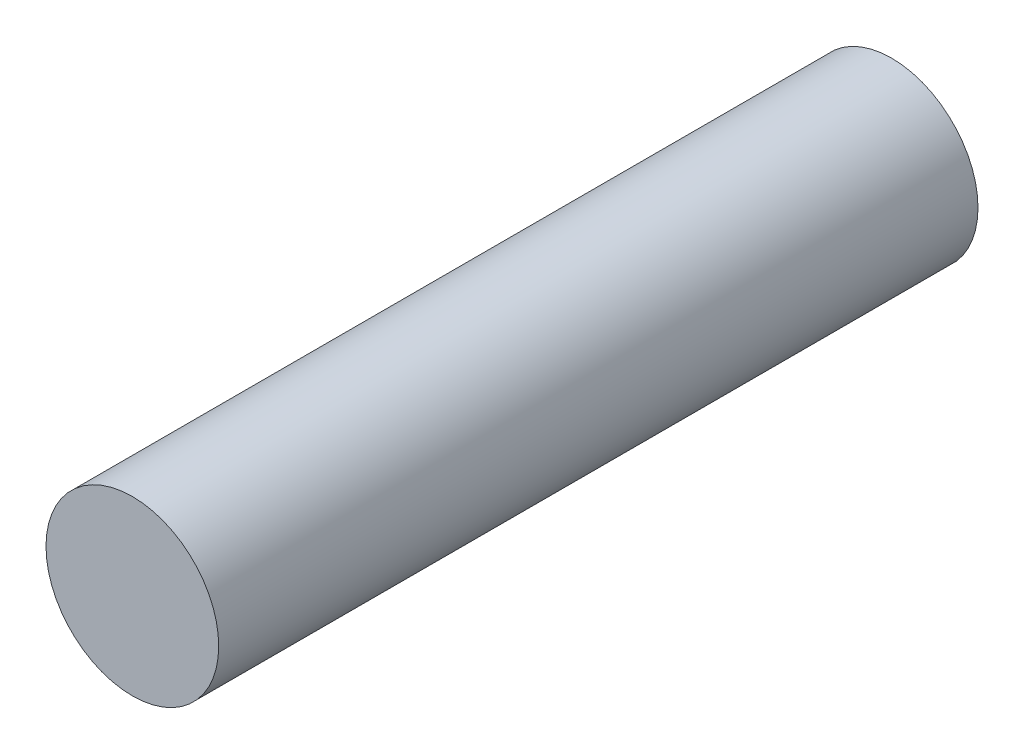
ISO-10303-21;
HEADER;
FILE_DESCRIPTION(('STEP AP214'),'2;1');
FILE_NAME('part.step','',(''),(''),'','','');
FILE_SCHEMA(('AUTOMOTIVE_DESIGN { 1 0 10303 214 1 1 1 1 }'));
ENDSEC;
DATA;
#1=APPLICATION_CONTEXT('core data for automotive mechanical design processes');
#2=APPLICATION_PROTOCOL_DEFINITION('international standard','automotive_design',2000,#1);
#3=PRODUCT_CONTEXT('',#1,'mechanical');
#4=PRODUCT('Part','Part','',(#3));
#5=PRODUCT_RELATED_PRODUCT_CATEGORY('part','',(#4));
#6=PRODUCT_DEFINITION_FORMATION('','',#4);
#7=PRODUCT_DEFINITION_CONTEXT('part definition',#1,'design');
#8=PRODUCT_DEFINITION('design','',#6,#7);
#9=PRODUCT_DEFINITION_SHAPE('','',#8);
#10=(LENGTH_UNIT() NAMED_UNIT(*) SI_UNIT(.MILLI.,.METRE.));
#11=(NAMED_UNIT(*) PLANE_ANGLE_UNIT() SI_UNIT($,.RADIAN.));
#12=(NAMED_UNIT(*) SI_UNIT($,.STERADIAN.) SOLID_ANGLE_UNIT());
#13=UNCERTAINTY_MEASURE_WITH_UNIT(LENGTH_MEASURE(1.E-05),#10,'distance_accuracy_value','');
#14=(GEOMETRIC_REPRESENTATION_CONTEXT(3) GLOBAL_UNCERTAINTY_ASSIGNED_CONTEXT((#13)) GLOBAL_UNIT_ASSIGNED_CONTEXT((#10,
#11,#12)) REPRESENTATION_CONTEXT('',''));
#15=CARTESIAN_POINT('',(0.,0.,0.));
#16=DIRECTION('',(0.,0.,1.));
#17=DIRECTION('',(1.,0.,0.));
#18=AXIS2_PLACEMENT_3D('',#15,#16,#17);
#19=CARTESIAN_POINT('',(0.660445151874721,8.68013628178195,71.));
#20=DIRECTION('',(0.,0.,-1.));
#21=DIRECTION('',(-1.,0.,0.));
#22=AXIS2_PLACEMENT_3D('',#19,#20,#21);
#23=CYLINDRICAL_SURFACE('',#22,8.075);
#24=CARTESIAN_POINT('',(0.660445151874721,8.68013628178195,71.));
#25=DIRECTION('',(0.,0.,1.));
#26=DIRECTION('',(1.,0.,0.));
#27=AXIS2_PLACEMENT_3D('',#24,#25,#26);
#28=CIRCLE('',#27,8.075);
#29=CARTESIAN_POINT('',(8.73544515187472,8.68013628178195,71.));
#30=VERTEX_POINT('',#29);
#31=EDGE_CURVE('E10',#30,#30,#28,.T.);
#32=ORIENTED_EDGE('',*,*,#31,.F.);
#33=EDGE_LOOP('',(#32));
#34=FACE_BOUND('',#33,.T.);
#35=CARTESIAN_POINT('',(0.660445151874721,8.68013628178195,0.));
#36=DIRECTION('',(0.,0.,1.));
#37=DIRECTION('',(1.,0.,0.));
#38=AXIS2_PLACEMENT_3D('',#35,#36,#37);
#39=CIRCLE('',#38,8.075);
#40=CARTESIAN_POINT('',(8.73544515187472,8.68013628178195,0.));
#41=VERTEX_POINT('',#40);
#42=EDGE_CURVE('E35',#41,#41,#39,.T.);
#43=ORIENTED_EDGE('',*,*,#42,.T.);
#44=EDGE_LOOP('',(#43));
#45=FACE_BOUND('',#44,.T.);
#46=ADVANCED_FACE('F32',(#34,#45),#23,.T.);
#47=CARTESIAN_POINT('',(0.660445151874721,8.68013628178195,71.));
#48=DIRECTION('',(0.,0.,1.));
#49=DIRECTION('',(1.,0.,0.));
#50=AXIS2_PLACEMENT_3D('',#47,#48,#49);
#51=PLANE('',#50);
#52=ORIENTED_EDGE('',*,*,#31,.T.);
#53=EDGE_LOOP('',(#52));
#54=FACE_BOUND('',#53,.T.);
#55=ADVANCED_FACE('F47',(#54),#51,.T.);
#56=CARTESIAN_POINT('',(0.660445151874721,8.68013628178195,0.));
#57=DIRECTION('',(0.,0.,1.));
#58=DIRECTION('',(1.,0.,0.));
#59=AXIS2_PLACEMENT_3D('',#56,#57,#58);
#60=PLANE('',#59);
#61=ORIENTED_EDGE('',*,*,#42,.F.);
#62=EDGE_LOOP('',(#61));
#63=FACE_BOUND('',#62,.T.);
#64=ADVANCED_FACE('F45',(#63),#60,.F.);
#65=CLOSED_SHELL('',(#46,#55,#64));
#66=MANIFOLD_SOLID_BREP('B2',#65);
#67=ADVANCED_BREP_SHAPE_REPRESENTATION('',(#18,#66),#14);
#68=SHAPE_DEFINITION_REPRESENTATION(#9,#67);
ENDSEC;
END-ISO-10303-21;
